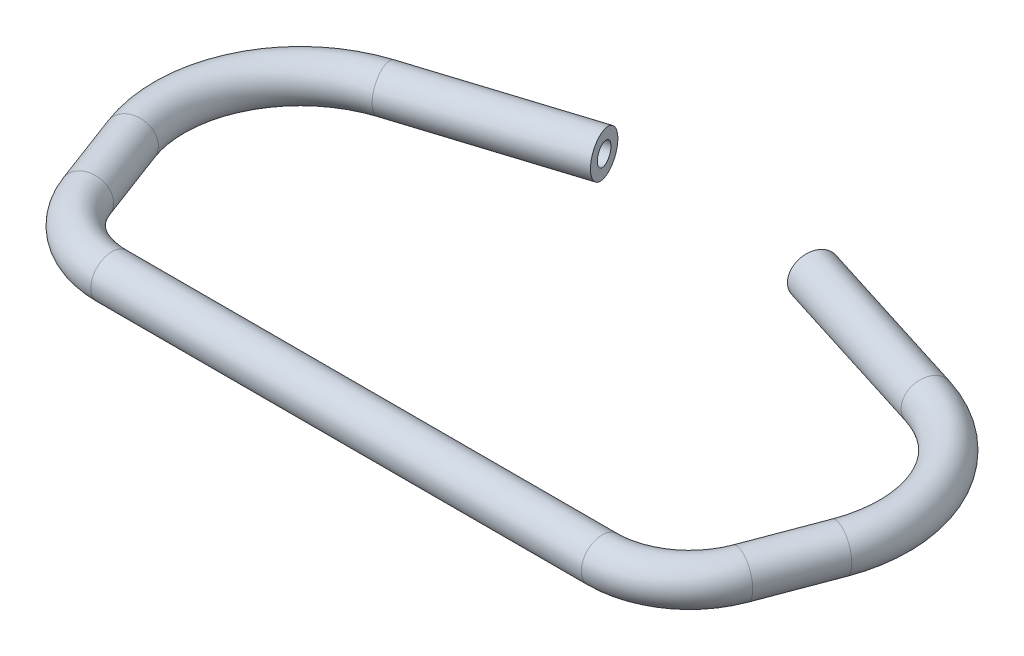
ISO-10303-21;
HEADER;
FILE_DESCRIPTION(('STEP AP214'),'2;1');
FILE_NAME('part.step','',(''),(''),'','','');
FILE_SCHEMA(('AUTOMOTIVE_DESIGN { 1 0 10303 214 1 1 1 1 }'));
ENDSEC;
DATA;
#1=APPLICATION_CONTEXT('core data for automotive mechanical design processes');
#2=APPLICATION_PROTOCOL_DEFINITION('international standard','automotive_design',2000,#1);
#3=PRODUCT_CONTEXT('',#1,'mechanical');
#4=PRODUCT('Part','Part','',(#3));
#5=PRODUCT_RELATED_PRODUCT_CATEGORY('part','',(#4));
#6=PRODUCT_DEFINITION_FORMATION('','',#4);
#7=PRODUCT_DEFINITION_CONTEXT('part definition',#1,'design');
#8=PRODUCT_DEFINITION('design','',#6,#7);
#9=PRODUCT_DEFINITION_SHAPE('','',#8);
#10=(LENGTH_UNIT() NAMED_UNIT(*) SI_UNIT(.MILLI.,.METRE.));
#11=(NAMED_UNIT(*) PLANE_ANGLE_UNIT() SI_UNIT($,.RADIAN.));
#12=(NAMED_UNIT(*) SI_UNIT($,.STERADIAN.) SOLID_ANGLE_UNIT());
#13=UNCERTAINTY_MEASURE_WITH_UNIT(LENGTH_MEASURE(1.E-05),#10,'distance_accuracy_value','');
#14=(GEOMETRIC_REPRESENTATION_CONTEXT(3) GLOBAL_UNCERTAINTY_ASSIGNED_CONTEXT((#13)) GLOBAL_UNIT_ASSIGNED_CONTEXT((#10,
#11,#12)) REPRESENTATION_CONTEXT('',''));
#15=CARTESIAN_POINT('',(0.,0.,0.));
#16=DIRECTION('',(0.,0.,1.));
#17=DIRECTION('',(1.,0.,0.));
#18=AXIS2_PLACEMENT_3D('',#15,#16,#17);
#19=CARTESIAN_POINT('',(-60.,0.,-201.498846579287));
#20=DIRECTION('',(-0.953716950748228,0.,0.30070579950427));
#21=DIRECTION('',(0.30070579950427,0.,0.953716950748228));
#22=AXIS2_PLACEMENT_3D('',#19,#20,#21);
#23=CYLINDRICAL_SURFACE('',#22,12.);
#24=CARTESIAN_POINT('',(-155.05293496282,0.,-171.528771306117));
#25=DIRECTION('',(-0.953716950748228,0.,0.30070579950427));
#26=DIRECTION('',(0.30070579950427,0.,0.953716950748228));
#27=AXIS2_PLACEMENT_3D('',#24,#25,#26);
#28=CIRCLE('',#27,12.);
#29=CARTESIAN_POINT('',(-158.661404556872,0.,-182.973374715096));
#30=VERTEX_POINT('',#29);
#31=EDGE_CURVE('E52',#30,#30,#28,.T.);
#32=ORIENTED_EDGE('',*,*,#31,.F.);
#33=EDGE_LOOP('',(#32));
#34=FACE_BOUND('',#33,.T.);
#35=CARTESIAN_POINT('',(-60.,0.,-201.498846579287));
#36=DIRECTION('',(-0.953716950748228,0.,0.30070579950427));
#37=DIRECTION('',(0.30070579950427,0.,0.953716950748228));
#38=AXIS2_PLACEMENT_3D('',#35,#36,#37);
#39=CIRCLE('',#38,12.);
#40=CARTESIAN_POINT('',(-56.3915304059488,0.,-190.054243170308));
#41=VERTEX_POINT('',#40);
#42=EDGE_CURVE('E49',#41,#41,#39,.T.);
#43=ORIENTED_EDGE('',*,*,#42,.T.);
#44=EDGE_LOOP('',(#43));
#45=FACE_BOUND('',#44,.T.);
#46=ADVANCED_FACE('F28',(#34,#45),#23,.T.);
#47=CARTESIAN_POINT('',(-132.5,0.,-99.9999999999999));
#48=DIRECTION('',(0.,1.,0.));
#49=DIRECTION('',(0.,0.,1.));
#50=AXIS2_PLACEMENT_3D('',#47,#48,#49);
#51=TOROIDAL_SURFACE('',#50,75.,12.);
#52=CARTESIAN_POINT('',(-202.693282774536,0.,-73.5821451791778));
#53=DIRECTION('',(0.352238064277629,0.,0.935910436993812));
#54=DIRECTION('',(0.935910436993812,0.,-0.352238064277629));
#55=AXIS2_PLACEMENT_3D('',#52,#53,#54);
#56=CIRCLE('',#55,12.);
#57=CARTESIAN_POINT('',(-213.924208018462,0.,-69.3552884078462));
#58=VERTEX_POINT('',#57);
#59=EDGE_CURVE('E55',#58,#58,#56,.T.);
#60=CARTESIAN_POINT('',(-132.5,0.,-99.9999999999999));
#61=DIRECTION('',(0.,1.,0.));
#62=DIRECTION('',(0.,0.,1.));
#63=AXIS2_PLACEMENT_3D('',#60,#61,#62);
#64=CIRCLE('',#63,87.);
#65=EDGE_CURVE('',#30,#58,#64,.T.);
#66=ORIENTED_EDGE('',*,*,#31,.T.);
#67=ORIENTED_EDGE('',*,*,#59,.F.);
#68=ORIENTED_EDGE('',*,*,#65,.T.);
#69=ORIENTED_EDGE('',*,*,#65,.F.);
#70=EDGE_LOOP('',(#66,#68,#67,#69));
#71=FACE_BOUND('',#70,.T.);
#72=ADVANCED_FACE('F112',(#71),#51,.T.);
#73=CARTESIAN_POINT('',(-202.693282774536,0.,-73.5821451791778));
#74=DIRECTION('',(0.352238064277629,0.,0.935910436993812));
#75=DIRECTION('',(0.935910436993812,0.,-0.352238064277629));
#76=AXIS2_PLACEMENT_3D('',#73,#74,#75);
#77=CYLINDRICAL_SURFACE('',#76,12.);
#78=CARTESIAN_POINT('',(-187.18954300181,0.,-32.3880967861185));
#79=DIRECTION('',(0.352238064277629,0.,0.935910436993812));
#80=DIRECTION('',(0.935910436993812,0.,-0.352238064277629));
#81=AXIS2_PLACEMENT_3D('',#78,#79,#80);
#82=CIRCLE('',#81,12.);
#83=CARTESIAN_POINT('',(-198.420468245736,0.,-28.161240014787));
#84=VERTEX_POINT('',#83);
#85=EDGE_CURVE('E58',#84,#84,#82,.T.);
#86=ORIENTED_EDGE('',*,*,#85,.F.);
#87=EDGE_LOOP('',(#86));
#88=FACE_BOUND('',#87,.T.);
#89=ORIENTED_EDGE('',*,*,#59,.T.);
#90=EDGE_LOOP('',(#89));
#91=FACE_BOUND('',#90,.T.);
#92=ADVANCED_FACE('F116',(#88,#91),#77,.T.);
#93=CARTESIAN_POINT('',(-140.394021152119,0.,-50.));
#94=DIRECTION('',(0.,1.,0.));
#95=DIRECTION('',(0.,0.,1.));
#96=AXIS2_PLACEMENT_3D('',#93,#94,#95);
#97=TOROIDAL_SURFACE('',#96,50.,12.);
#98=CARTESIAN_POINT('',(-140.394021152119,0.,0.));
#99=DIRECTION('',(1.,0.,0.));
#100=DIRECTION('',(0.,0.,-1.));
#101=AXIS2_PLACEMENT_3D('',#98,#99,#100);
#102=CIRCLE('',#101,12.);
#103=CARTESIAN_POINT('',(-140.394021152119,0.,12.));
#104=VERTEX_POINT('',#103);
#105=EDGE_CURVE('E61',#104,#104,#102,.T.);
#106=CARTESIAN_POINT('',(-140.394021152119,0.,-50.));
#107=DIRECTION('',(0.,1.,0.));
#108=DIRECTION('',(0.,0.,1.));
#109=AXIS2_PLACEMENT_3D('',#106,#107,#108);
#110=CIRCLE('',#109,62.);
#111=EDGE_CURVE('',#84,#104,#110,.T.);
#112=ORIENTED_EDGE('',*,*,#85,.T.);
#113=ORIENTED_EDGE('',*,*,#105,.F.);
#114=ORIENTED_EDGE('',*,*,#111,.T.);
#115=ORIENTED_EDGE('',*,*,#111,.F.);
#116=EDGE_LOOP('',(#112,#114,#113,#115));
#117=FACE_BOUND('',#116,.T.);
#118=ADVANCED_FACE('F120',(#117),#97,.T.);
#119=CARTESIAN_POINT('',(-140.394021152119,0.,0.));
#120=DIRECTION('',(1.,0.,0.));
#121=DIRECTION('',(0.,0.,-1.));
#122=AXIS2_PLACEMENT_3D('',#119,#120,#121);
#123=CYLINDRICAL_SURFACE('',#122,12.);
#124=CARTESIAN_POINT('',(140.394021152119,0.,0.));
#125=DIRECTION('',(1.,0.,0.));
#126=DIRECTION('',(0.,0.,-1.));
#127=AXIS2_PLACEMENT_3D('',#124,#125,#126);
#128=CIRCLE('',#127,12.);
#129=CARTESIAN_POINT('',(140.394021152119,0.,12.));
#130=VERTEX_POINT('',#129);
#131=EDGE_CURVE('E64',#130,#130,#128,.T.);
#132=ORIENTED_EDGE('',*,*,#131,.F.);
#133=EDGE_LOOP('',(#132));
#134=FACE_BOUND('',#133,.T.);
#135=ORIENTED_EDGE('',*,*,#105,.T.);
#136=EDGE_LOOP('',(#135));
#137=FACE_BOUND('',#136,.T.);
#138=ADVANCED_FACE('F124',(#134,#137),#123,.T.);
#139=CARTESIAN_POINT('',(140.394021152119,0.,-50.));
#140=DIRECTION('',(0.,1.,0.));
#141=DIRECTION('',(0.,0.,1.));
#142=AXIS2_PLACEMENT_3D('',#139,#140,#141);
#143=TOROIDAL_SURFACE('',#142,50.,12.);
#144=CARTESIAN_POINT('',(187.18954300181,0.,-32.3880967861185));
#145=DIRECTION('',(0.35223806427763,0.,-0.935910436993812));
#146=DIRECTION('',(-0.935910436993812,0.,-0.35223806427763));
#147=AXIS2_PLACEMENT_3D('',#144,#145,#146);
#148=CIRCLE('',#147,12.);
#149=CARTESIAN_POINT('',(198.420468245736,0.,-28.1612400147869));
#150=VERTEX_POINT('',#149);
#151=EDGE_CURVE('E67',#150,#150,#148,.T.);
#152=CARTESIAN_POINT('',(140.394021152119,0.,-50.));
#153=DIRECTION('',(0.,1.,0.));
#154=DIRECTION('',(0.,0.,1.));
#155=AXIS2_PLACEMENT_3D('',#152,#153,#154);
#156=CIRCLE('',#155,62.);
#157=EDGE_CURVE('',#130,#150,#156,.T.);
#158=ORIENTED_EDGE('',*,*,#131,.T.);
#159=ORIENTED_EDGE('',*,*,#151,.F.);
#160=ORIENTED_EDGE('',*,*,#157,.T.);
#161=ORIENTED_EDGE('',*,*,#157,.F.);
#162=EDGE_LOOP('',(#158,#160,#159,#161));
#163=FACE_BOUND('',#162,.T.);
#164=ADVANCED_FACE('F86',(#163),#143,.T.);
#165=CARTESIAN_POINT('',(187.18954300181,0.,-32.3880967861185));
#166=DIRECTION('',(0.35223806427763,0.,-0.935910436993812));
#167=DIRECTION('',(-0.935910436993812,0.,-0.35223806427763));
#168=AXIS2_PLACEMENT_3D('',#165,#166,#167);
#169=CYLINDRICAL_SURFACE('',#168,12.);
#170=CARTESIAN_POINT('',(202.693282774536,0.,-73.5821451791777));
#171=DIRECTION('',(0.35223806427763,0.,-0.935910436993812));
#172=DIRECTION('',(-0.935910436993812,0.,-0.35223806427763));
#173=AXIS2_PLACEMENT_3D('',#170,#171,#172);
#174=CIRCLE('',#173,12.);
#175=CARTESIAN_POINT('',(213.924208018462,0.,-69.3552884078462));
#176=VERTEX_POINT('',#175);
#177=EDGE_CURVE('E69',#176,#176,#174,.T.);
#178=ORIENTED_EDGE('',*,*,#177,.F.);
#179=EDGE_LOOP('',(#178));
#180=FACE_BOUND('',#179,.T.);
#181=ORIENTED_EDGE('',*,*,#151,.T.);
#182=EDGE_LOOP('',(#181));
#183=FACE_BOUND('',#182,.T.);
#184=ADVANCED_FACE('F79',(#180,#183),#169,.T.);
#185=CARTESIAN_POINT('',(132.5,0.,-99.9999999999999));
#186=DIRECTION('',(0.,1.,0.));
#187=DIRECTION('',(0.,0.,1.));
#188=AXIS2_PLACEMENT_3D('',#185,#186,#187);
#189=TOROIDAL_SURFACE('',#188,75.,12.);
#190=CARTESIAN_POINT('',(155.05293496282,0.,-171.528771306117));
#191=DIRECTION('',(-0.953716950748228,0.,-0.300705799504271));
#192=DIRECTION('',(-0.300705799504271,0.,0.953716950748228));
#193=AXIS2_PLACEMENT_3D('',#190,#191,#192);
#194=CIRCLE('',#193,12.);
#195=CARTESIAN_POINT('',(158.661404556872,0.,-182.973374715096));
#196=VERTEX_POINT('',#195);
#197=EDGE_CURVE('E32',#196,#196,#194,.T.);
#198=CARTESIAN_POINT('',(132.5,0.,-99.9999999999999));
#199=DIRECTION('',(0.,1.,0.));
#200=DIRECTION('',(0.,0.,1.));
#201=AXIS2_PLACEMENT_3D('',#198,#199,#200);
#202=CIRCLE('',#201,87.);
#203=EDGE_CURVE('',#176,#196,#202,.T.);
#204=ORIENTED_EDGE('',*,*,#177,.T.);
#205=ORIENTED_EDGE('',*,*,#197,.F.);
#206=ORIENTED_EDGE('',*,*,#203,.T.);
#207=ORIENTED_EDGE('',*,*,#203,.F.);
#208=EDGE_LOOP('',(#204,#206,#205,#207));
#209=FACE_BOUND('',#208,.T.);
#210=ADVANCED_FACE('F77',(#209),#189,.T.);
#211=CARTESIAN_POINT('',(155.05293496282,0.,-171.528771306117));
#212=DIRECTION('',(-0.953716950748228,0.,-0.30070579950427));
#213=DIRECTION('',(-0.30070579950427,0.,0.953716950748228));
#214=AXIS2_PLACEMENT_3D('',#211,#212,#213);
#215=CYLINDRICAL_SURFACE('',#214,12.);
#216=CARTESIAN_POINT('',(60.,0.,-201.498846579287));
#217=DIRECTION('',(-0.953716950748228,0.,-0.30070579950427));
#218=DIRECTION('',(-0.30070579950427,0.,0.953716950748228));
#219=AXIS2_PLACEMENT_3D('',#216,#217,#218);
#220=CIRCLE('',#219,12.);
#221=CARTESIAN_POINT('',(56.3915304059488,0.,-190.054243170308));
#222=VERTEX_POINT('',#221);
#223=EDGE_CURVE('E45',#222,#222,#220,.T.);
#224=ORIENTED_EDGE('',*,*,#223,.F.);
#225=EDGE_LOOP('',(#224));
#226=FACE_BOUND('',#225,.T.);
#227=ORIENTED_EDGE('',*,*,#197,.T.);
#228=EDGE_LOOP('',(#227));
#229=FACE_BOUND('',#228,.T.);
#230=ADVANCED_FACE('F30',(#226,#229),#215,.T.);
#231=CARTESIAN_POINT('',(-60.,0.,-201.498846579287));
#232=DIRECTION('',(-0.953716950748228,0.,0.30070579950427));
#233=DIRECTION('',(0.30070579950427,0.,0.953716950748228));
#234=AXIS2_PLACEMENT_3D('',#231,#232,#233);
#235=PLANE('',#234);
#236=CARTESIAN_POINT('',(-60.,0.,-201.498846579287));
#237=DIRECTION('',(-0.953716950748228,0.,0.30070579950427));
#238=DIRECTION('',(0.30070579950427,0.,0.953716950748228));
#239=AXIS2_PLACEMENT_3D('',#236,#237,#238);
#240=CIRCLE('',#239,6.);
#241=CARTESIAN_POINT('',(-58.1957652029744,0.,-195.776544874797));
#242=VERTEX_POINT('',#241);
#243=EDGE_CURVE('E48',#242,#242,#240,.F.);
#244=ORIENTED_EDGE('',*,*,#243,.F.);
#245=EDGE_LOOP('',(#244));
#246=FACE_BOUND('',#245,.T.);
#247=ORIENTED_EDGE('',*,*,#42,.F.);
#248=EDGE_LOOP('',(#247));
#249=FACE_BOUND('',#248,.T.);
#250=ADVANCED_FACE('F84',(#246,#249),#235,.F.);
#251=CARTESIAN_POINT('',(60.,0.,-201.498846579287));
#252=DIRECTION('',(-0.953716950748228,0.,-0.30070579950427));
#253=DIRECTION('',(-0.30070579950427,0.,0.953716950748228));
#254=AXIS2_PLACEMENT_3D('',#251,#252,#253);
#255=PLANE('',#254);
#256=CARTESIAN_POINT('',(60.,0.,-201.498846579287));
#257=DIRECTION('',(-0.953716950748228,0.,-0.30070579950427));
#258=DIRECTION('',(-0.30070579950427,0.,0.953716950748228));
#259=AXIS2_PLACEMENT_3D('',#256,#257,#258);
#260=CIRCLE('',#259,6.);
#261=CARTESIAN_POINT('',(58.1957652029744,0.,-195.776544874797));
#262=VERTEX_POINT('',#261);
#263=EDGE_CURVE('E10',#262,#262,#260,.F.);
#264=ORIENTED_EDGE('',*,*,#263,.T.);
#265=EDGE_LOOP('',(#264));
#266=FACE_BOUND('',#265,.T.);
#267=ORIENTED_EDGE('',*,*,#223,.T.);
#268=EDGE_LOOP('',(#267));
#269=FACE_BOUND('',#268,.T.);
#270=ADVANCED_FACE('F103',(#266,#269),#255,.T.);
#271=CARTESIAN_POINT('',(-60.,0.,-201.498846579287));
#272=DIRECTION('',(-0.953716950748228,0.,0.30070579950427));
#273=DIRECTION('',(0.30070579950427,0.,0.953716950748228));
#274=AXIS2_PLACEMENT_3D('',#271,#272,#273);
#275=CYLINDRICAL_SURFACE('',#274,6.);
#276=CARTESIAN_POINT('',(-155.05293496282,0.,-171.528771306117));
#277=DIRECTION('',(-0.953716950748228,0.,0.30070579950427));
#278=DIRECTION('',(0.30070579950427,0.,0.953716950748228));
#279=AXIS2_PLACEMENT_3D('',#276,#277,#278);
#280=CIRCLE('',#279,6.);
#281=CARTESIAN_POINT('',(-156.857169759846,0.,-177.251073010606));
#282=VERTEX_POINT('',#281);
#283=EDGE_CURVE('E277',#282,#282,#280,.F.);
#284=ORIENTED_EDGE('',*,*,#283,.F.);
#285=EDGE_LOOP('',(#284));
#286=FACE_BOUND('',#285,.T.);
#287=ORIENTED_EDGE('',*,*,#243,.T.);
#288=EDGE_LOOP('',(#287));
#289=FACE_BOUND('',#288,.T.);
#290=ADVANCED_FACE('F106',(#286,#289),#275,.F.);
#291=CARTESIAN_POINT('',(-132.5,0.,-99.9999999999999));
#292=DIRECTION('',(0.,1.,0.));
#293=DIRECTION('',(0.,0.,1.));
#294=AXIS2_PLACEMENT_3D('',#291,#292,#293);
#295=TOROIDAL_SURFACE('',#294,75.,6.);
#296=CARTESIAN_POINT('',(-202.693282774536,0.,-73.5821451791778));
#297=DIRECTION('',(0.352238064277629,0.,0.935910436993812));
#298=DIRECTION('',(0.935910436993812,0.,-0.352238064277629));
#299=AXIS2_PLACEMENT_3D('',#296,#297,#298);
#300=CIRCLE('',#299,6.);
#301=CARTESIAN_POINT('',(-208.308745396499,0.,-71.468716793512));
#302=VERTEX_POINT('',#301);
#303=EDGE_CURVE('E274',#302,#302,#300,.F.);
#304=CARTESIAN_POINT('',(-132.5,0.,-99.9999999999999));
#305=DIRECTION('',(0.,1.,0.));
#306=DIRECTION('',(0.,0.,1.));
#307=AXIS2_PLACEMENT_3D('',#304,#305,#306);
#308=CIRCLE('',#307,81.);
#309=EDGE_CURVE('',#282,#302,#308,.T.);
#310=ORIENTED_EDGE('',*,*,#283,.T.);
#311=ORIENTED_EDGE('',*,*,#303,.F.);
#312=ORIENTED_EDGE('',*,*,#309,.T.);
#313=ORIENTED_EDGE('',*,*,#309,.F.);
#314=EDGE_LOOP('',(#310,#312,#311,#313));
#315=FACE_BOUND('',#314,.T.);
#316=ADVANCED_FACE('F185',(#315),#295,.F.);
#317=CARTESIAN_POINT('',(-202.693282774536,0.,-73.5821451791778));
#318=DIRECTION('',(0.352238064277629,0.,0.935910436993812));
#319=DIRECTION('',(0.935910436993812,0.,-0.352238064277629));
#320=AXIS2_PLACEMENT_3D('',#317,#318,#319);
#321=CYLINDRICAL_SURFACE('',#320,6.);
#322=CARTESIAN_POINT('',(-187.18954300181,0.,-32.3880967861185));
#323=DIRECTION('',(0.352238064277629,0.,0.935910436993812));
#324=DIRECTION('',(0.935910436993812,0.,-0.352238064277629));
#325=AXIS2_PLACEMENT_3D('',#322,#323,#324);
#326=CIRCLE('',#325,6.);
#327=CARTESIAN_POINT('',(-192.805005623773,0.,-30.2746684004528));
#328=VERTEX_POINT('',#327);
#329=EDGE_CURVE('E271',#328,#328,#326,.F.);
#330=ORIENTED_EDGE('',*,*,#329,.F.);
#331=EDGE_LOOP('',(#330));
#332=FACE_BOUND('',#331,.T.);
#333=ORIENTED_EDGE('',*,*,#303,.T.);
#334=EDGE_LOOP('',(#333));
#335=FACE_BOUND('',#334,.T.);
#336=ADVANCED_FACE('F195',(#332,#335),#321,.F.);
#337=CARTESIAN_POINT('',(-140.394021152119,0.,-50.));
#338=DIRECTION('',(0.,1.,0.));
#339=DIRECTION('',(0.,0.,1.));
#340=AXIS2_PLACEMENT_3D('',#337,#338,#339);
#341=TOROIDAL_SURFACE('',#340,50.,6.);
#342=CARTESIAN_POINT('',(-140.394021152119,0.,0.));
#343=DIRECTION('',(1.,0.,0.));
#344=DIRECTION('',(0.,0.,-1.));
#345=AXIS2_PLACEMENT_3D('',#342,#343,#344);
#346=CIRCLE('',#345,6.);
#347=CARTESIAN_POINT('',(-140.394021152119,0.,6.00000000000003));
#348=VERTEX_POINT('',#347);
#349=EDGE_CURVE('E266',#348,#348,#346,.F.);
#350=CARTESIAN_POINT('',(-140.394021152119,0.,-50.));
#351=DIRECTION('',(0.,1.,0.));
#352=DIRECTION('',(0.,0.,1.));
#353=AXIS2_PLACEMENT_3D('',#350,#351,#352);
#354=CIRCLE('',#353,56.);
#355=EDGE_CURVE('',#328,#348,#354,.T.);
#356=ORIENTED_EDGE('',*,*,#329,.T.);
#357=ORIENTED_EDGE('',*,*,#349,.F.);
#358=ORIENTED_EDGE('',*,*,#355,.T.);
#359=ORIENTED_EDGE('',*,*,#355,.F.);
#360=EDGE_LOOP('',(#356,#358,#357,#359));
#361=FACE_BOUND('',#360,.T.);
#362=ADVANCED_FACE('F205',(#361),#341,.F.);
#363=CARTESIAN_POINT('',(-140.394021152119,0.,0.));
#364=DIRECTION('',(1.,0.,0.));
#365=DIRECTION('',(0.,0.,-1.));
#366=AXIS2_PLACEMENT_3D('',#363,#364,#365);
#367=CYLINDRICAL_SURFACE('',#366,6.);
#368=CARTESIAN_POINT('',(140.394021152119,0.,0.));
#369=DIRECTION('',(1.,0.,0.));
#370=DIRECTION('',(0.,0.,-1.));
#371=AXIS2_PLACEMENT_3D('',#368,#369,#370);
#372=CIRCLE('',#371,6.);
#373=CARTESIAN_POINT('',(140.394021152119,0.,6.00000000000001));
#374=VERTEX_POINT('',#373);
#375=EDGE_CURVE('E263',#374,#374,#372,.F.);
#376=ORIENTED_EDGE('',*,*,#375,.F.);
#377=EDGE_LOOP('',(#376));
#378=FACE_BOUND('',#377,.T.);
#379=ORIENTED_EDGE('',*,*,#349,.T.);
#380=EDGE_LOOP('',(#379));
#381=FACE_BOUND('',#380,.T.);
#382=ADVANCED_FACE('F215',(#378,#381),#367,.F.);
#383=CARTESIAN_POINT('',(140.394021152119,0.,-50.));
#384=DIRECTION('',(0.,1.,0.));
#385=DIRECTION('',(0.,0.,1.));
#386=AXIS2_PLACEMENT_3D('',#383,#384,#385);
#387=TOROIDAL_SURFACE('',#386,50.,6.);
#388=CARTESIAN_POINT('',(187.18954300181,0.,-32.3880967861185));
#389=DIRECTION('',(0.35223806427763,0.,-0.935910436993812));
#390=DIRECTION('',(-0.935910436993812,0.,-0.35223806427763));
#391=AXIS2_PLACEMENT_3D('',#388,#389,#390);
#392=CIRCLE('',#391,6.);
#393=CARTESIAN_POINT('',(192.805005623773,0.,-30.2746684004527));
#394=VERTEX_POINT('',#393);
#395=EDGE_CURVE('E262',#394,#394,#392,.F.);
#396=CARTESIAN_POINT('',(140.394021152119,0.,-50.));
#397=DIRECTION('',(0.,1.,0.));
#398=DIRECTION('',(0.,0.,1.));
#399=AXIS2_PLACEMENT_3D('',#396,#397,#398);
#400=CIRCLE('',#399,56.);
#401=EDGE_CURVE('',#374,#394,#400,.T.);
#402=ORIENTED_EDGE('',*,*,#375,.T.);
#403=ORIENTED_EDGE('',*,*,#395,.F.);
#404=ORIENTED_EDGE('',*,*,#401,.T.);
#405=ORIENTED_EDGE('',*,*,#401,.F.);
#406=EDGE_LOOP('',(#402,#404,#403,#405));
#407=FACE_BOUND('',#406,.T.);
#408=ADVANCED_FACE('F225',(#407),#387,.F.);
#409=CARTESIAN_POINT('',(187.18954300181,0.,-32.3880967861185));
#410=DIRECTION('',(0.35223806427763,0.,-0.935910436993812));
#411=DIRECTION('',(-0.935910436993812,0.,-0.35223806427763));
#412=AXIS2_PLACEMENT_3D('',#409,#410,#411);
#413=CYLINDRICAL_SURFACE('',#412,6.);
#414=CARTESIAN_POINT('',(202.693282774536,0.,-73.5821451791777));
#415=DIRECTION('',(0.35223806427763,0.,-0.935910436993812));
#416=DIRECTION('',(-0.935910436993812,0.,-0.35223806427763));
#417=AXIS2_PLACEMENT_3D('',#414,#415,#416);
#418=CIRCLE('',#417,6.);
#419=CARTESIAN_POINT('',(208.308745396499,0.,-71.4687167935119));
#420=VERTEX_POINT('',#419);
#421=EDGE_CURVE('E41',#420,#420,#418,.F.);
#422=ORIENTED_EDGE('',*,*,#421,.F.);
#423=EDGE_LOOP('',(#422));
#424=FACE_BOUND('',#423,.T.);
#425=ORIENTED_EDGE('',*,*,#395,.T.);
#426=EDGE_LOOP('',(#425));
#427=FACE_BOUND('',#426,.T.);
#428=ADVANCED_FACE('F97',(#424,#427),#413,.F.);
#429=CARTESIAN_POINT('',(132.5,0.,-99.9999999999999));
#430=DIRECTION('',(0.,1.,0.));
#431=DIRECTION('',(0.,0.,1.));
#432=AXIS2_PLACEMENT_3D('',#429,#430,#431);
#433=TOROIDAL_SURFACE('',#432,75.,6.);
#434=CARTESIAN_POINT('',(155.05293496282,0.,-171.528771306117));
#435=DIRECTION('',(-0.953716950748228,0.,-0.300705799504271));
#436=DIRECTION('',(-0.300705799504271,0.,0.953716950748228));
#437=AXIS2_PLACEMENT_3D('',#434,#435,#436);
#438=CIRCLE('',#437,6.);
#439=CARTESIAN_POINT('',(156.857169759846,0.,-177.251073010606));
#440=VERTEX_POINT('',#439);
#441=EDGE_CURVE('E36',#440,#440,#438,.F.);
#442=CARTESIAN_POINT('',(132.5,0.,-99.9999999999999));
#443=DIRECTION('',(0.,1.,0.));
#444=DIRECTION('',(0.,0.,1.));
#445=AXIS2_PLACEMENT_3D('',#442,#443,#444);
#446=CIRCLE('',#445,81.);
#447=EDGE_CURVE('',#420,#440,#446,.T.);
#448=ORIENTED_EDGE('',*,*,#421,.T.);
#449=ORIENTED_EDGE('',*,*,#441,.F.);
#450=ORIENTED_EDGE('',*,*,#447,.T.);
#451=ORIENTED_EDGE('',*,*,#447,.F.);
#452=EDGE_LOOP('',(#448,#450,#449,#451));
#453=FACE_BOUND('',#452,.T.);
#454=ADVANCED_FACE('F91',(#453),#433,.F.);
#455=CARTESIAN_POINT('',(155.05293496282,0.,-171.528771306117));
#456=DIRECTION('',(-0.953716950748228,0.,-0.30070579950427));
#457=DIRECTION('',(-0.30070579950427,0.,0.953716950748228));
#458=AXIS2_PLACEMENT_3D('',#455,#456,#457);
#459=CYLINDRICAL_SURFACE('',#458,6.);
#460=ORIENTED_EDGE('',*,*,#263,.F.);
#461=EDGE_LOOP('',(#460));
#462=FACE_BOUND('',#461,.T.);
#463=ORIENTED_EDGE('',*,*,#441,.T.);
#464=EDGE_LOOP('',(#463));
#465=FACE_BOUND('',#464,.T.);
#466=ADVANCED_FACE('F89',(#462,#465),#459,.F.);
#467=CLOSED_SHELL('',(#46,#72,#92,#118,#138,#164,#184,#210,#230,#250,#270,#290,#316,#336,#362,
#382,#408,#428,#454,#466));
#468=MANIFOLD_SOLID_BREP('B2',#467);
#469=ADVANCED_BREP_SHAPE_REPRESENTATION('',(#18,#468),#14);
#470=SHAPE_DEFINITION_REPRESENTATION(#9,#469);
ENDSEC;
END-ISO-10303-21;
